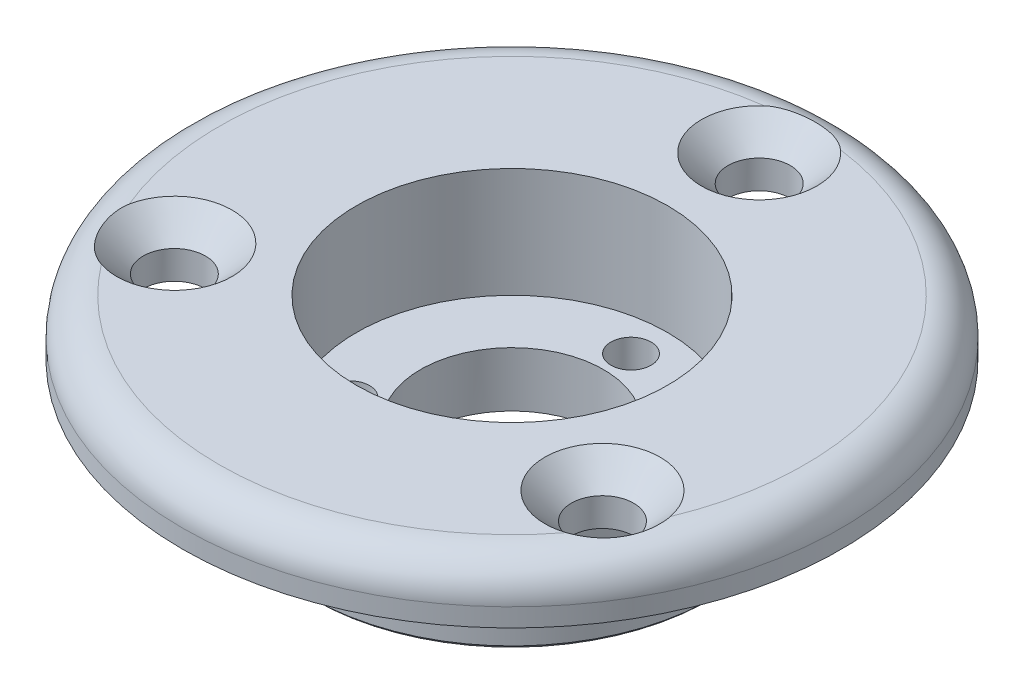
ISO-10303-21;
HEADER;
FILE_DESCRIPTION(('STEP AP214'),'2;1');
FILE_NAME('part.step','',(''),(''),'','','');
FILE_SCHEMA(('AUTOMOTIVE_DESIGN { 1 0 10303 214 1 1 1 1 }'));
ENDSEC;
DATA;
#1=APPLICATION_CONTEXT('core data for automotive mechanical design processes');
#2=APPLICATION_PROTOCOL_DEFINITION('international standard','automotive_design',2000,#1);
#3=PRODUCT_CONTEXT('',#1,'mechanical');
#4=PRODUCT('Part','Part','',(#3));
#5=PRODUCT_RELATED_PRODUCT_CATEGORY('part','',(#4));
#6=PRODUCT_DEFINITION_FORMATION('','',#4);
#7=PRODUCT_DEFINITION_CONTEXT('part definition',#1,'design');
#8=PRODUCT_DEFINITION('design','',#6,#7);
#9=PRODUCT_DEFINITION_SHAPE('','',#8);
#10=(LENGTH_UNIT() NAMED_UNIT(*) SI_UNIT(.MILLI.,.METRE.));
#11=(NAMED_UNIT(*) PLANE_ANGLE_UNIT() SI_UNIT($,.RADIAN.));
#12=(NAMED_UNIT(*) SI_UNIT($,.STERADIAN.) SOLID_ANGLE_UNIT());
#13=UNCERTAINTY_MEASURE_WITH_UNIT(LENGTH_MEASURE(1.E-05),#10,'distance_accuracy_value','');
#14=(GEOMETRIC_REPRESENTATION_CONTEXT(3) GLOBAL_UNCERTAINTY_ASSIGNED_CONTEXT((#13)) GLOBAL_UNIT_ASSIGNED_CONTEXT((#10,
#11,#12)) REPRESENTATION_CONTEXT('',''));
#15=CARTESIAN_POINT('',(0.,0.,0.));
#16=DIRECTION('',(0.,0.,1.));
#17=DIRECTION('',(1.,0.,0.));
#18=AXIS2_PLACEMENT_3D('',#15,#16,#17);
#19=CARTESIAN_POINT('',(0.,-3.,5.));
#20=DIRECTION('',(0.,-1.,0.));
#21=DIRECTION('',(0.,0.,-1.));
#22=AXIS2_PLACEMENT_3D('',#19,#20,#21);
#23=PLANE('',#22);
#24=CARTESIAN_POINT('',(0.,-3.,-6.5));
#25=DIRECTION('',(0.,-1.,0.));
#26=DIRECTION('',(0.,0.,-1.));
#27=AXIS2_PLACEMENT_3D('',#24,#25,#26);
#28=CIRCLE('',#27,2.2);
#29=CARTESIAN_POINT('',(-1.39735993677342,-3.,-4.80076923076923));
#30=VERTEX_POINT('',#29);
#31=CARTESIAN_POINT('',(1.39735993677341,-3.,-4.80076923076923));
#32=VERTEX_POINT('',#31);
#33=EDGE_CURVE('E50',#30,#32,#28,.T.);
#34=ORIENTED_EDGE('',*,*,#33,.F.);
#35=CARTESIAN_POINT('',(0.,-3.,0.));
#36=DIRECTION('',(0.,1.,0.));
#37=DIRECTION('',(0.,0.,1.));
#38=AXIS2_PLACEMENT_3D('',#35,#36,#37);
#39=CIRCLE('',#38,5.);
#40=CARTESIAN_POINT('',(-4.85626807993953,-3.,1.19023541190825));
#41=VERTEX_POINT('',#40);
#42=EDGE_CURVE('E95',#30,#41,#39,.T.);
#43=ORIENTED_EDGE('',*,*,#42,.T.);
#44=CARTESIAN_POINT('',(-5.62916512459884,-3.,3.25000000000003));
#45=DIRECTION('',(0.,-1.,0.));
#46=DIRECTION('',(0.,0.,-1.));
#47=AXIS2_PLACEMENT_3D('',#44,#45,#46);
#48=CIRCLE('',#47,2.2);
#49=CARTESIAN_POINT('',(-3.45890814316611,-3.,3.61053381886103));
#50=VERTEX_POINT('',#49);
#51=EDGE_CURVE('E222',#50,#41,#48,.T.);
#52=ORIENTED_EDGE('',*,*,#51,.F.);
#53=CARTESIAN_POINT('',(3.45890814316611,-3.,3.61053381886102));
#54=VERTEX_POINT('',#53);
#55=EDGE_CURVE('E107',#50,#54,#39,.T.);
#56=ORIENTED_EDGE('',*,*,#55,.T.);
#57=CARTESIAN_POINT('',(5.62916512459884,-3.,3.25000000000003));
#58=DIRECTION('',(0.,-1.,0.));
#59=DIRECTION('',(0.,0.,-1.));
#60=AXIS2_PLACEMENT_3D('',#57,#58,#59);
#61=CIRCLE('',#60,2.2);
#62=CARTESIAN_POINT('',(4.85626807993953,-3.,1.19023541190824));
#63=VERTEX_POINT('',#62);
#64=EDGE_CURVE('E57',#63,#54,#61,.T.);
#65=ORIENTED_EDGE('',*,*,#64,.F.);
#66=EDGE_CURVE('E97',#63,#32,#39,.T.);
#67=ORIENTED_EDGE('',*,*,#66,.T.);
#68=EDGE_LOOP('',(#34,#43,#52,#56,#65,#67));
#69=FACE_BOUND('',#68,.T.);
#70=CARTESIAN_POINT('',(0.,-3.,0.));
#71=DIRECTION('',(0.,-1.,0.));
#72=DIRECTION('',(0.,0.,-1.));
#73=AXIS2_PLACEMENT_3D('',#70,#71,#72);
#74=CIRCLE('',#73,10.8);
#75=CARTESIAN_POINT('',(0.,-3.,-10.8));
#76=VERTEX_POINT('',#75);
#77=EDGE_CURVE('E133',#76,#76,#74,.T.);
#78=ORIENTED_EDGE('',*,*,#77,.T.);
#79=EDGE_LOOP('',(#78));
#80=FACE_BOUND('',#79,.T.);
#81=ADVANCED_FACE('F35',(#69,#80),#23,.T.);
#82=CARTESIAN_POINT('',(0.,0.,0.));
#83=DIRECTION('',(0.,1.,0.));
#84=DIRECTION('',(0.,0.,1.));
#85=AXIS2_PLACEMENT_3D('',#82,#83,#84);
#86=CYLINDRICAL_SURFACE('',#85,11.);
#87=CARTESIAN_POINT('',(0.,-2.80000000000001,0.));
#88=DIRECTION('',(0.,-1.,0.));
#89=DIRECTION('',(0.,0.,-1.));
#90=AXIS2_PLACEMENT_3D('',#87,#88,#89);
#91=CIRCLE('',#90,11.);
#92=CARTESIAN_POINT('',(0.,-2.80000000000001,-11.));
#93=VERTEX_POINT('',#92);
#94=EDGE_CURVE('E130',#93,#93,#91,.F.);
#95=ORIENTED_EDGE('',*,*,#94,.T.);
#96=EDGE_LOOP('',(#95));
#97=FACE_BOUND('',#96,.T.);
#98=CARTESIAN_POINT('',(0.,3.,0.));
#99=DIRECTION('',(0.,1.,0.));
#100=DIRECTION('',(0.,0.,1.));
#101=AXIS2_PLACEMENT_3D('',#98,#99,#100);
#102=CIRCLE('',#101,11.);
#103=CARTESIAN_POINT('',(0.,3.,11.));
#104=VERTEX_POINT('',#103);
#105=EDGE_CURVE('E127',#104,#104,#102,.T.);
#106=ORIENTED_EDGE('',*,*,#105,.F.);
#107=EDGE_LOOP('',(#106));
#108=FACE_BOUND('',#107,.T.);
#109=ADVANCED_FACE('F234',(#97,#108),#86,.T.);
#110=CARTESIAN_POINT('',(0.,3.,11.));
#111=DIRECTION('',(0.,-1.,0.));
#112=DIRECTION('',(0.,0.,-1.));
#113=AXIS2_PLACEMENT_3D('',#110,#111,#112);
#114=PLANE('',#113);
#115=CARTESIAN_POINT('',(0.,3.,-13.5));
#116=DIRECTION('',(0.,-1.,0.));
#117=DIRECTION('',(0.,0.,-1.));
#118=AXIS2_PLACEMENT_3D('',#115,#116,#117);
#119=CIRCLE('',#118,1.7);
#120=CARTESIAN_POINT('',(0.,3.,-15.2));
#121=VERTEX_POINT('',#120);
#122=EDGE_CURVE('E142',#121,#121,#119,.T.);
#123=ORIENTED_EDGE('',*,*,#122,.F.);
#124=EDGE_LOOP('',(#123));
#125=FACE_BOUND('',#124,.T.);
#126=CARTESIAN_POINT('',(11.6913429510899,3.,6.75000000000006));
#127=DIRECTION('',(0.,-1.,0.));
#128=DIRECTION('',(0.,0.,-1.));
#129=AXIS2_PLACEMENT_3D('',#126,#127,#128);
#130=CIRCLE('',#129,1.7);
#131=CARTESIAN_POINT('',(11.6913429510899,3.,5.05000000000006));
#132=VERTEX_POINT('',#131);
#133=EDGE_CURVE('E137',#132,#132,#130,.T.);
#134=ORIENTED_EDGE('',*,*,#133,.F.);
#135=EDGE_LOOP('',(#134));
#136=FACE_BOUND('',#135,.T.);
#137=CARTESIAN_POINT('',(-11.6913429510899,3.,6.75000000000006));
#138=DIRECTION('',(0.,-1.,0.));
#139=DIRECTION('',(0.,0.,-1.));
#140=AXIS2_PLACEMENT_3D('',#137,#138,#139);
#141=CIRCLE('',#140,1.7);
#142=CARTESIAN_POINT('',(-11.6913429510899,3.,5.05000000000006));
#143=VERTEX_POINT('',#142);
#144=EDGE_CURVE('E105',#143,#143,#141,.T.);
#145=ORIENTED_EDGE('',*,*,#144,.F.);
#146=EDGE_LOOP('',(#145));
#147=FACE_BOUND('',#146,.T.);
#148=ORIENTED_EDGE('',*,*,#105,.T.);
#149=EDGE_LOOP('',(#148));
#150=FACE_BOUND('',#149,.T.);
#151=CARTESIAN_POINT('',(0.,3.,0.));
#152=DIRECTION('',(0.,1.,0.));
#153=DIRECTION('',(0.,0.,1.));
#154=AXIS2_PLACEMENT_3D('',#151,#152,#153);
#155=CIRCLE('',#154,18.);
#156=CARTESIAN_POINT('',(0.,3.,18.));
#157=VERTEX_POINT('',#156);
#158=EDGE_CURVE('E124',#157,#157,#155,.T.);
#159=ORIENTED_EDGE('',*,*,#158,.F.);
#160=EDGE_LOOP('',(#159));
#161=FACE_BOUND('',#160,.T.);
#162=ADVANCED_FACE('F239',(#125,#136,#147,#150,#161),#114,.T.);
#163=CARTESIAN_POINT('',(0.,0.,0.));
#164=DIRECTION('',(0.,1.,0.));
#165=DIRECTION('',(0.,0.,1.));
#166=AXIS2_PLACEMENT_3D('',#163,#164,#165);
#167=CYLINDRICAL_SURFACE('',#166,18.);
#168=CARTESIAN_POINT('',(0.,4.,0.));
#169=DIRECTION('',(0.,1.,0.));
#170=DIRECTION('',(0.,0.,1.));
#171=AXIS2_PLACEMENT_3D('',#168,#169,#170);
#172=CIRCLE('',#171,18.);
#173=CARTESIAN_POINT('',(0.,4.,18.));
#174=VERTEX_POINT('',#173);
#175=EDGE_CURVE('E188',#174,#174,#172,.F.);
#176=ORIENTED_EDGE('',*,*,#175,.T.);
#177=EDGE_LOOP('',(#176));
#178=FACE_BOUND('',#177,.T.);
#179=ORIENTED_EDGE('',*,*,#158,.T.);
#180=EDGE_LOOP('',(#179));
#181=FACE_BOUND('',#180,.T.);
#182=ADVANCED_FACE('F262',(#178,#181),#167,.T.);
#183=CARTESIAN_POINT('',(0.,6.,8.5));
#184=DIRECTION('',(0.,1.,0.));
#185=DIRECTION('',(0.,0.,1.));
#186=AXIS2_PLACEMENT_3D('',#183,#184,#185);
#187=PLANE('',#186);
#188=CARTESIAN_POINT('',(11.6913429510899,6.,6.75000000000006));
#189=DIRECTION('',(0.,1.,0.));
#190=DIRECTION('',(0.,0.,1.));
#191=AXIS2_PLACEMENT_3D('',#188,#189,#190);
#192=CIRCLE('',#191,3.15);
#193=CARTESIAN_POINT('',(14.7795350233813,6.,6.12905739022298));
#194=VERTEX_POINT('',#193);
#195=CARTESIAN_POINT('',(12.6976869128764,6.,9.73492409125864));
#196=VERTEX_POINT('',#195);
#197=EDGE_CURVE('E145',#194,#196,#192,.T.);
#198=ORIENTED_EDGE('',*,*,#197,.F.);
#199=CARTESIAN_POINT('',(0.,6.,0.));
#200=DIRECTION('',(0.,1.,0.));
#201=DIRECTION('',(0.,0.,1.));
#202=AXIS2_PLACEMENT_3D('',#199,#200,#201);
#203=CIRCLE('',#202,16.);
#204=CARTESIAN_POINT('',(2.08184811050485,6.,-15.8639814814815));
#205=VERTEX_POINT('',#204);
#206=EDGE_CURVE('E150',#194,#205,#203,.T.);
#207=ORIENTED_EDGE('',*,*,#206,.T.);
#208=CARTESIAN_POINT('',(0.,6.,-13.5));
#209=DIRECTION('',(0.,1.,0.));
#210=DIRECTION('',(0.,0.,1.));
#211=AXIS2_PLACEMENT_3D('',#208,#209,#210);
#212=CIRCLE('',#211,3.15);
#213=CARTESIAN_POINT('',(-2.08184811050485,6.,-15.8639814814815));
#214=VERTEX_POINT('',#213);
#215=EDGE_CURVE('E295',#214,#205,#212,.T.);
#216=ORIENTED_EDGE('',*,*,#215,.F.);
#217=CARTESIAN_POINT('',(0.,6.,0.));
#218=DIRECTION('',(0.,1.,0.));
#219=DIRECTION('',(0.,0.,1.));
#220=AXIS2_PLACEMENT_3D('',#217,#218,#219);
#221=CIRCLE('',#220,16.);
#222=CARTESIAN_POINT('',(-14.7795350233813,6.,6.12905739022298));
#223=VERTEX_POINT('',#222);
#224=EDGE_CURVE('E148',#214,#223,#221,.T.);
#225=ORIENTED_EDGE('',*,*,#224,.T.);
#226=CARTESIAN_POINT('',(-11.6913429510899,6.,6.75000000000006));
#227=DIRECTION('',(0.,1.,0.));
#228=DIRECTION('',(0.,0.,1.));
#229=AXIS2_PLACEMENT_3D('',#226,#227,#228);
#230=CIRCLE('',#229,3.15);
#231=CARTESIAN_POINT('',(-12.6976869128764,6.,9.73492409125864));
#232=VERTEX_POINT('',#231);
#233=EDGE_CURVE('E140',#232,#223,#230,.T.);
#234=ORIENTED_EDGE('',*,*,#233,.F.);
#235=CARTESIAN_POINT('',(0.,6.,0.));
#236=DIRECTION('',(0.,1.,0.));
#237=DIRECTION('',(0.,0.,1.));
#238=AXIS2_PLACEMENT_3D('',#235,#236,#237);
#239=CIRCLE('',#238,16.);
#240=EDGE_CURVE('E135',#232,#196,#239,.T.);
#241=ORIENTED_EDGE('',*,*,#240,.T.);
#242=EDGE_LOOP('',(#198,#207,#216,#225,#234,#241));
#243=FACE_BOUND('',#242,.T.);
#244=CARTESIAN_POINT('',(0.,6.,0.));
#245=DIRECTION('',(0.,1.,0.));
#246=DIRECTION('',(0.,0.,1.));
#247=AXIS2_PLACEMENT_3D('',#244,#245,#246);
#248=CIRCLE('',#247,8.5);
#249=CARTESIAN_POINT('',(0.,6.,8.5));
#250=VERTEX_POINT('',#249);
#251=EDGE_CURVE('E119',#250,#250,#248,.T.);
#252=ORIENTED_EDGE('',*,*,#251,.F.);
#253=EDGE_LOOP('',(#252));
#254=FACE_BOUND('',#253,.T.);
#255=ADVANCED_FACE('F267',(#243,#254),#187,.T.);
#256=CARTESIAN_POINT('',(0.,0.,0.));
#257=DIRECTION('',(0.,1.,0.));
#258=DIRECTION('',(0.,0.,1.));
#259=AXIS2_PLACEMENT_3D('',#256,#257,#258);
#260=CYLINDRICAL_SURFACE('',#259,8.5);
#261=ORIENTED_EDGE('',*,*,#251,.T.);
#262=EDGE_LOOP('',(#261));
#263=FACE_BOUND('',#262,.T.);
#264=CARTESIAN_POINT('',(0.,0.,0.));
#265=DIRECTION('',(0.,1.,0.));
#266=DIRECTION('',(0.,0.,1.));
#267=AXIS2_PLACEMENT_3D('',#264,#265,#266);
#268=CIRCLE('',#267,8.5);
#269=CARTESIAN_POINT('',(0.,0.,8.5));
#270=VERTEX_POINT('',#269);
#271=EDGE_CURVE('E116',#270,#270,#268,.T.);
#272=ORIENTED_EDGE('',*,*,#271,.F.);
#273=EDGE_LOOP('',(#272));
#274=FACE_BOUND('',#273,.T.);
#275=ADVANCED_FACE('F273',(#263,#274),#260,.F.);
#276=CARTESIAN_POINT('',(0.,0.,5.));
#277=DIRECTION('',(0.,1.,0.));
#278=DIRECTION('',(0.,0.,1.));
#279=AXIS2_PLACEMENT_3D('',#276,#277,#278);
#280=PLANE('',#279);
#281=CARTESIAN_POINT('',(0.,0.,-6.5));
#282=DIRECTION('',(0.,1.,0.));
#283=DIRECTION('',(0.,0.,1.));
#284=AXIS2_PLACEMENT_3D('',#281,#282,#283);
#285=CIRCLE('',#284,1.09999999999999);
#286=CARTESIAN_POINT('',(0.,0.,-5.40000000000001));
#287=VERTEX_POINT('',#286);
#288=EDGE_CURVE('E40',#287,#287,#285,.T.);
#289=ORIENTED_EDGE('',*,*,#288,.F.);
#290=EDGE_LOOP('',(#289));
#291=FACE_BOUND('',#290,.T.);
#292=CARTESIAN_POINT('',(5.62916512459884,0.,3.25000000000003));
#293=DIRECTION('',(0.,1.,0.));
#294=DIRECTION('',(0.,0.,1.));
#295=AXIS2_PLACEMENT_3D('',#292,#293,#294);
#296=CIRCLE('',#295,1.09999999999999);
#297=CARTESIAN_POINT('',(5.62916512459884,0.,4.35000000000002));
#298=VERTEX_POINT('',#297);
#299=EDGE_CURVE('E220',#298,#298,#296,.T.);
#300=ORIENTED_EDGE('',*,*,#299,.F.);
#301=EDGE_LOOP('',(#300));
#302=FACE_BOUND('',#301,.T.);
#303=CARTESIAN_POINT('',(-5.62916512459884,0.,3.25000000000003));
#304=DIRECTION('',(0.,1.,0.));
#305=DIRECTION('',(0.,0.,1.));
#306=AXIS2_PLACEMENT_3D('',#303,#304,#305);
#307=CIRCLE('',#306,1.09999999999999);
#308=CARTESIAN_POINT('',(-5.62916512459884,0.,4.35000000000002));
#309=VERTEX_POINT('',#308);
#310=EDGE_CURVE('E196',#309,#309,#307,.T.);
#311=ORIENTED_EDGE('',*,*,#310,.F.);
#312=EDGE_LOOP('',(#311));
#313=FACE_BOUND('',#312,.T.);
#314=ORIENTED_EDGE('',*,*,#271,.T.);
#315=EDGE_LOOP('',(#314));
#316=FACE_BOUND('',#315,.T.);
#317=CARTESIAN_POINT('',(0.,0.,0.));
#318=DIRECTION('',(0.,1.,0.));
#319=DIRECTION('',(0.,0.,1.));
#320=AXIS2_PLACEMENT_3D('',#317,#318,#319);
#321=CIRCLE('',#320,5.);
#322=CARTESIAN_POINT('',(0.,0.,5.));
#323=VERTEX_POINT('',#322);
#324=EDGE_CURVE('E114',#323,#323,#321,.T.);
#325=ORIENTED_EDGE('',*,*,#324,.F.);
#326=EDGE_LOOP('',(#325));
#327=FACE_BOUND('',#326,.T.);
#328=ADVANCED_FACE('F253',(#291,#302,#313,#316,#327),#280,.T.);
#329=CARTESIAN_POINT('',(0.,0.,0.));
#330=DIRECTION('',(0.,1.,0.));
#331=DIRECTION('',(0.,0.,1.));
#332=AXIS2_PLACEMENT_3D('',#329,#330,#331);
#333=CYLINDRICAL_SURFACE('',#332,5.);
#334=CARTESIAN_POINT('',(1.39759249001839,-3.0002,-4.80070153538461));
#335=CARTESIAN_POINT('',(1.34290477132306,-2.95322698470851,-4.81661120550945));
#336=CARTESIAN_POINT('',(1.28738980897507,-2.9069106747556,-4.83177003410822));
#337=CARTESIAN_POINT('',(1.17410549312497,-2.8161603229236,-4.86054863272246));
#338=CARTESIAN_POINT('',(1.11632844791568,-2.77173401322828,-4.87416240152792));
#339=CARTESIAN_POINT('',(0.996471678843506,-2.68434533718589,-4.90009352708124));
#340=CARTESIAN_POINT('',(0.93431380394682,-2.64147282199566,-4.91235671301323));
#341=CARTESIAN_POINT('',(0.80690977489325,-2.56015925635464,-4.93488353270095));
#342=CARTESIAN_POINT('',(0.741668707107225,-2.52171124360547,-4.94515032599656));
#343=CARTESIAN_POINT('',(0.607469026010579,-2.45128310639206,-4.96342310169418));
#344=CARTESIAN_POINT('',(0.538513271867463,-2.41929809500635,-4.97143079411734));
#345=CARTESIAN_POINT('',(0.396983915871148,-2.36507005017128,-4.9847153349031));
#346=CARTESIAN_POINT('',(0.324440007192171,-2.34275839170678,-4.99001146992408));
#347=CARTESIAN_POINT('',(0.212718298924938,-2.31889714303432,-4.99561653550752));
#348=CARTESIAN_POINT('',(0.174613308938815,-2.31253129784518,-4.99709757043583));
#349=CARTESIAN_POINT('',(0.0979348917087521,-2.30352327999584,-4.99918761353278));
#350=CARTESIAN_POINT('',(0.0593615343795264,-2.30088055830074,-4.99979675027714));
#351=CARTESIAN_POINT('',(-0.0178341321682291,-2.29949306582036,-5.00011702334243));
#352=CARTESIAN_POINT('',(-0.05645639014404,-2.30074564107835,-4.99982877107528));
#353=CARTESIAN_POINT('',(-0.133366213988251,-2.3070519960109,-4.99836943561154));
#354=CARTESIAN_POINT('',(-0.17165373079917,-2.31210632370278,-4.99719822513769));
#355=CARTESIAN_POINT('',(-0.291313743584783,-2.33361228267078,-4.99217367412059));
#356=CARTESIAN_POINT('',(-0.371496585835684,-2.35648592274487,-4.98678484228079));
#357=CARTESIAN_POINT('',(-0.52773839494247,-2.41421454970962,-4.97270200565582));
#358=CARTESIAN_POINT('',(-0.603745928334117,-2.44919141538506,-4.96397428019951));
#359=CARTESIAN_POINT('',(-0.744503396838622,-2.5233290926934,-4.94472249088295));
#360=CARTESIAN_POINT('',(-0.809648714276447,-2.56182099870416,-4.93443369421833));
#361=CARTESIAN_POINT('',(-0.936871071497187,-2.64319504148982,-4.91186858881065));
#362=CARTESIAN_POINT('',(-0.998943363127662,-2.68608367590253,-4.89958932245346));
#363=CARTESIAN_POINT('',(-1.11828317397184,-2.77322340010962,-4.87370882192471));
#364=CARTESIAN_POINT('',(-1.17564332924179,-2.81736829348418,-4.86017186687038));
#365=CARTESIAN_POINT('',(-1.28813370377718,-2.90753028880107,-4.83156703666756));
#366=CARTESIAN_POINT('',(-1.34327122173924,-2.95354006141355,-4.81650486110348));
#367=CARTESIAN_POINT('',(-1.39759249001839,-3.0002,-4.80070153538461));
#368=B_SPLINE_CURVE_WITH_KNOTS('',3,(#334,#335,#336,#337,#338,#339,#340,#341,#342,#343,#344,
#345,#346,#347,#348,#349,#350,#351,#352,#353,#354,#355,#356,#357,#358,#359,#360,#361,#362,#363,
#364,#365,#366,#367),.UNSPECIFIED.,.F.,.F.,(4,2,2,2,2,2,2,2,2,2,2,2,2,2,2,2,4),(0.,
0.221517356790479,0.443867624240583,0.673203911135931,0.902174236794023,1.13097077599598,
1.35811650716166,1.47393428084682,1.58973497353568,1.70545678579975,1.82119528239935,
2.0702953798257,2.32198063642909,2.55079778511758,2.77995810056625,3.00078836443513,
3.22082189912864),.UNSPECIFIED.);
#369=EDGE_CURVE('E11',#32,#30,#368,.T.);
#370=ORIENTED_EDGE('',*,*,#369,.F.);
#371=ORIENTED_EDGE('',*,*,#66,.F.);
#372=CARTESIAN_POINT('',(3.45873324062083,-3.0002,3.61070136818659));
#373=CARTESIAN_POINT('',(3.49985527846243,-2.95322698470851,3.57129524958384));
#374=CARTESIAN_POINT('',(3.54074069029457,-2.9069106747556,3.53079729619973));
#375=CARTESIAN_POINT('',(3.62230584570487,-2.8161603229236,3.44707950013032));
#376=CARTESIAN_POINT('',(3.66298423793629,-2.77173401322828,3.40384999562621));
#377=CARTESIAN_POINT('',(3.74536963595028,-2.68434533718589,3.31301655157084));
#378=CARTESIAN_POINT('',(3.78706880394705,-2.64147282199566,3.26531784583105));
#379=CARTESIAN_POINT('',(3.87027961658988,-2.56015925635464,3.16624612997003));
#380=CARTESIAN_POINT('',(3.91179145429229,-2.52171124360548,3.11487910454512));
#381=CARTESIAN_POINT('',(3.99471598279241,-2.45128310639206,3.00779515938446));
#382=CARTESIAN_POINT('',(4.03612872492812,-2.41929809500635,2.95208157077099));
#383=CARTESIAN_POINT('',(4.11839815272435,-2.36507005017128,2.83615582348981));
#384=CARTESIAN_POINT('',(4.15925669453388,-2.34275839170678,2.77597902319448));
#385=CARTESIAN_POINT('',(4.21997167785263,-2.31889714303432,2.68202771847259));
#386=CARTESIAN_POINT('',(4.24030678671751,-2.31253129784518,2.64976834659781));
#387=CARTESIAN_POINT('',(4.2804560257495,-2.30352327999584,2.58440791090307));
#388=CARTESIAN_POINT('',(4.30027023230911,-2.30088055830074,2.55130697191888));
#389=CARTESIAN_POINT('',(4.33914543019368,-2.29949306582036,2.4846137001591));
#390=CARTESIAN_POINT('',(4.35820692539553,-2.30074564107835,2.45102171746696));
#391=CARTESIAN_POINT('',(4.39539801573339,-2.30705199601091,2.38368618848541));
#392=CARTESIAN_POINT('',(4.41352747611532,-2.31210632370278,2.34994262104241));
#393=CARTESIAN_POINT('',(4.46900609368471,-2.33361228267078,2.24380173464435));
#394=CARTESIAN_POINT('',(4.50443064954017,-2.35648592274487,2.17166694038753));
#395=CARTESIAN_POINT('',(4.570355459819,-2.41421454970962,2.02931614625533));
#396=CARTESIAN_POINT('',(4.6008007945524,-2.44919141538506,1.95912782873101));
#397=CARTESIAN_POINT('',(4.6545069901882,-2.5233290926934,1.82760239057544));
#398=CARTESIAN_POINT('',(4.67816928962119,-2.56182099870417,1.76604049240437));
#399=CARTESIAN_POINT('',(4.72223851370944,-2.64319504148984,1.64458014641801));
#400=CARTESIAN_POINT('',(4.74264050291951,-2.68608367590256,1.5846843318163));
#401=CARTESIAN_POINT('',(4.77989723742105,-2.77322340010965,1.46839277367803));
#402=CARTESIAN_POINT('',(4.79685396808909,-2.81736829348422,1.41194894452206));
#403=CARTESIAN_POINT('',(4.82832664573021,-2.90753028880111,1.30022700739176));
#404=CARTESIAN_POINT('',(4.84285117803648,-2.9535400614136,1.24494542835295));
#405=CARTESIAN_POINT('',(4.85632573063924,-3.00020000000006,1.19000016719799));
#406=B_SPLINE_CURVE_WITH_KNOTS('',3,(#372,#373,#374,#375,#376,#377,#378,#379,#380,#381,#382,
#383,#384,#385,#386,#387,#388,#389,#390,#391,#392,#393,#394,#395,#396,#397,#398,#399,#400,#401,
#402,#403,#404,#405),.UNSPECIFIED.,.F.,.F.,(4,2,2,2,2,2,2,2,2,2,2,2,2,2,2,2,4),(0.,
0.221517356790478,0.443867624240581,0.67320391113593,0.90217423679402,1.13097077599597,
1.35811650716166,1.47393428084681,1.58973497353568,1.70545678579974,1.82119528239935,
2.0702953798257,2.32198063642908,2.5507977851176,2.77995810056629,3.0007883644352,
3.22082189912873),.UNSPECIFIED.);
#407=EDGE_CURVE('E45',#54,#63,#406,.T.);
#408=ORIENTED_EDGE('',*,*,#407,.F.);
#409=ORIENTED_EDGE('',*,*,#55,.F.);
#410=CARTESIAN_POINT('',(-4.85632573063924,-3.00020000000006,1.19000016719799));
#411=CARTESIAN_POINT('',(-4.84276004978551,-2.95322698470856,1.24531595592559));
#412=CARTESIAN_POINT('',(-4.82813049926966,-2.90691067475565,1.30097273790847));
#413=CARTESIAN_POINT('',(-4.79641133882986,-2.81616032292364,1.41346913259213));
#414=CARTESIAN_POINT('',(-4.77931268585199,-2.77173401322832,1.4703124059017));
#415=CARTESIAN_POINT('',(-4.74184131479381,-2.68434533718592,1.5870769755104));
#416=CARTESIAN_POINT('',(-4.72138260789389,-2.64147282199568,1.64703886718219));
#417=CARTESIAN_POINT('',(-4.67718939148314,-2.56015925635466,1.76863740273094));
#418=CARTESIAN_POINT('',(-4.65346016139953,-2.52171124360549,1.83027122145147));
#419=CARTESIAN_POINT('',(-4.602185008803,-2.45128310639207,1.95562794230975));
#420=CARTESIAN_POINT('',(-4.57464199679559,-2.41929809500636,2.01934922334638));
#421=CARTESIAN_POINT('',(-4.51538206859551,-2.36507005017129,2.14855951141332));
#422=CARTESIAN_POINT('',(-4.48369670172606,-2.34275839170678,2.21403244672962));
#423=CARTESIAN_POINT('',(-4.43268997677758,-2.31889714303432,2.31358881703496));
#424=CARTESIAN_POINT('',(-4.41492009565633,-2.31253129784518,2.34732922383805));
#425=CARTESIAN_POINT('',(-4.37839091745826,-2.30352327999585,2.41477970262974));
#426=CARTESIAN_POINT('',(-4.35963176668865,-2.30088055830074,2.44848977835829));
#427=CARTESIAN_POINT('',(-4.32131129802545,-2.29949306582036,2.51550332318336));
#428=CARTESIAN_POINT('',(-4.3017505352515,-2.30074564107835,2.54880705360835));
#429=CARTESIAN_POINT('',(-4.26203180174515,-2.30705199601091,2.61468324712615));
#430=CARTESIAN_POINT('',(-4.24187374531616,-2.31210632370278,2.64725560409531));
#431=CARTESIAN_POINT('',(-4.17769235009993,-2.33361228267078,2.74837193947627));
#432=CARTESIAN_POINT('',(-4.13293406370449,-2.35648592274487,2.81511790189329));
#433=CARTESIAN_POINT('',(-4.04261706487653,-2.41421454970962,2.94338585940052));
#434=CARTESIAN_POINT('',(-3.99705486621829,-2.44919141538505,3.00484645146853));
#435=CARTESIAN_POINT('',(-3.91000359334958,-2.52332909269339,3.11712010030753));
#436=CARTESIAN_POINT('',(-3.86852057534474,-2.56182099870415,3.16839320181399));
#437=CARTESIAN_POINT('',(-3.78536744221224,-2.64319504148981,3.26728844239265));
#438=CARTESIAN_POINT('',(-3.74369713979184,-2.68608367590253,3.31490499063716));
#439=CARTESIAN_POINT('',(-3.6616140634492,-2.77322340010961,3.40531604824667));
#440=CARTESIAN_POINT('',(-3.62121063884728,-2.81736829348418,3.44822292234831));
#441=CARTESIAN_POINT('',(-3.540192941953,-2.90753028880106,3.53134002927577));
#442=CARTESIAN_POINT('',(-3.49957995629721,-2.95354006141355,3.5715594327505));
#443=CARTESIAN_POINT('',(-3.45873324062083,-3.0002,3.61070136818659));
#444=B_SPLINE_CURVE_WITH_KNOTS('',3,(#410,#411,#412,#413,#414,#415,#416,#417,#418,#419,#420,
#421,#422,#423,#424,#425,#426,#427,#428,#429,#430,#431,#432,#433,#434,#435,#436,#437,#438,#439,
#440,#441,#442,#443),.UNSPECIFIED.,.F.,.F.,(4,2,2,2,2,2,2,2,2,2,2,2,2,2,2,2,4),(0.,
0.221517356790498,0.44386762424062,0.673203911135989,0.902174236794099,1.13097077599605,
1.35811650716174,1.47393428084689,1.58973497353576,1.70545678579982,1.82119528239943,
2.07029537982578,2.32198063642916,2.55079778511766,2.77995810056633,3.00078836443521,
3.22082189912873),.UNSPECIFIED.);
#445=EDGE_CURVE('E104',#41,#50,#444,.T.);
#446=ORIENTED_EDGE('',*,*,#445,.F.);
#447=ORIENTED_EDGE('',*,*,#42,.F.);
#448=EDGE_LOOP('',(#370,#371,#408,#409,#446,#447));
#449=FACE_BOUND('',#448,.T.);
#450=ORIENTED_EDGE('',*,*,#324,.T.);
#451=EDGE_LOOP('',(#450));
#452=FACE_BOUND('',#451,.T.);
#453=ADVANCED_FACE('F101',(#449,#452),#333,.F.);
#454=CARTESIAN_POINT('',(0.,-2.80000000000001,0.));
#455=DIRECTION('',(0.,1.,0.));
#456=DIRECTION('',(0.,0.,1.));
#457=AXIS2_PLACEMENT_3D('',#454,#455,#456);
#458=CONICAL_SURFACE('',#457,11.,0.785398163397454);
#459=ORIENTED_EDGE('',*,*,#77,.F.);
#460=EDGE_LOOP('',(#459));
#461=FACE_BOUND('',#460,.T.);
#462=ORIENTED_EDGE('',*,*,#94,.F.);
#463=EDGE_LOOP('',(#462));
#464=FACE_BOUND('',#463,.T.);
#465=ADVANCED_FACE('F243',(#461,#464),#458,.T.);
#466=CARTESIAN_POINT('',(-11.6913429510899,6.,6.75000000000006));
#467=DIRECTION('',(0.,1.,0.));
#468=DIRECTION('',(0.,0.,1.));
#469=AXIS2_PLACEMENT_3D('',#466,#467,#468);
#470=CYLINDRICAL_SURFACE('',#469,1.7);
#471=ORIENTED_EDGE('',*,*,#144,.T.);
#472=EDGE_LOOP('',(#471));
#473=FACE_BOUND('',#472,.T.);
#474=CARTESIAN_POINT('',(-11.6913429510899,4.55,6.75000000000006));
#475=DIRECTION('',(0.,1.,0.));
#476=DIRECTION('',(0.,0.,1.));
#477=AXIS2_PLACEMENT_3D('',#474,#475,#476);
#478=CIRCLE('',#477,1.7);
#479=CARTESIAN_POINT('',(-11.6913429510899,4.55,8.45000000000006));
#480=VERTEX_POINT('',#479);
#481=EDGE_CURVE('E109',#480,#480,#478,.T.);
#482=ORIENTED_EDGE('',*,*,#481,.T.);
#483=EDGE_LOOP('',(#482));
#484=FACE_BOUND('',#483,.T.);
#485=ADVANCED_FACE('F245',(#473,#484),#470,.F.);
#486=CARTESIAN_POINT('',(-11.6913429510899,6.,6.75000000000006));
#487=DIRECTION('',(0.,1.,0.));
#488=DIRECTION('',(0.,0.,1.));
#489=AXIS2_PLACEMENT_3D('',#486,#487,#488);
#490=CONICAL_SURFACE('',#489,3.15,0.785398163397449);
#491=ORIENTED_EDGE('',*,*,#481,.F.);
#492=EDGE_LOOP('',(#491));
#493=FACE_BOUND('',#492,.T.);
#494=ORIENTED_EDGE('',*,*,#233,.T.);
#495=CARTESIAN_POINT('',(-14.7795350233813,6.,6.12905739022298));
#496=CARTESIAN_POINT('',(-14.7873395810359,5.99999668059333,6.16788784129385));
#497=CARTESIAN_POINT('',(-14.7940563452865,5.99963455352129,6.2069211992617));
#498=CARTESIAN_POINT('',(-14.8054327604498,5.99832889877805,6.28525859087468));
#499=CARTESIAN_POINT('',(-14.8100934332992,5.99738566049582,6.32456248016971));
#500=CARTESIAN_POINT('',(-14.8211601006317,5.99389365016638,6.44253664011186));
#501=CARTESIAN_POINT('',(-14.8246889220853,5.99068118655588,6.52146676621617));
#502=CARTESIAN_POINT('',(-14.8248445851107,5.98333199749789,6.67876213007903));
#503=CARTESIAN_POINT('',(-14.8215139750575,5.9792011107442,6.75712784258382));
#504=CARTESIAN_POINT('',(-14.8086467728351,5.97060004879904,6.9133790189026));
#505=CARTESIAN_POINT('',(-14.7991052830598,5.96612960831101,6.99126405470833));
#506=CARTESIAN_POINT('',(-14.7713911082979,5.95628146144715,7.16427936084401));
#507=CARTESIAN_POINT('',(-14.7517193667131,5.95093675469201,7.25917197216569));
#508=CARTESIAN_POINT('',(-14.7043749402551,5.94108384721435,7.44699115301427));
#509=CARTESIAN_POINT('',(-14.6767001670119,5.93657586533776,7.53991720257081));
#510=CARTESIAN_POINT('',(-14.613820573297,5.92883319408838,7.72353295732575));
#511=CARTESIAN_POINT('',(-14.5785944243677,5.92560218653479,7.81421549938756));
#512=CARTESIAN_POINT('',(-14.5011125559197,5.92072023998471,7.99256368517572));
#513=CARTESIAN_POINT('',(-14.4588569417074,5.91906927732053,8.08022937407292));
#514=CARTESIAN_POINT('',(-14.3671677247055,5.91747679938921,8.25301294751837));
#515=CARTESIAN_POINT('',(-14.3176583319631,5.91755483254687,8.33809079375306));
#516=CARTESIAN_POINT('',(-14.2121406777333,5.91946215511411,8.50409474347843));
#517=CARTESIAN_POINT('',(-14.1561325515106,5.92129140807949,8.58502093333124));
#518=CARTESIAN_POINT('',(-14.0378826684901,5.92654294077049,8.74211603524839));
#519=CARTESIAN_POINT('',(-13.9756416433869,5.92996503368053,8.81828550401489));
#520=CARTESIAN_POINT('',(-13.8451406324563,5.93808812474777,8.96519209542289));
#521=CARTESIAN_POINT('',(-13.7768822301461,5.94278878711502,9.03593063813939));
#522=CARTESIAN_POINT('',(-13.649870579238,5.95187733294112,9.15660137394334));
#523=CARTESIAN_POINT('',(-13.5922409905369,5.95611414111113,9.2077312065133));
#524=CARTESIAN_POINT('',(-13.473459684475,5.96474338615548,9.30569781549671));
#525=CARTESIAN_POINT('',(-13.4123087914936,5.96913578651189,9.35253559013197));
#526=CARTESIAN_POINT('',(-13.286781092404,5.9776391362702,9.4412023741888));
#527=CARTESIAN_POINT('',(-13.2224167234364,5.98175104410484,9.48304884806976));
#528=CARTESIAN_POINT('',(-13.0903954933055,5.98916335719407,9.56120287938179));
#529=CARTESIAN_POINT('',(-13.0227411752819,5.99246437768696,9.59751462814382));
#530=CARTESIAN_POINT('',(-12.9119903603987,5.99652204116984,9.65047219812097));
#531=CARTESIAN_POINT('',(-12.8698915342624,5.99776828452288,9.66917574543265));
#532=CARTESIAN_POINT('',(-12.7845916970507,5.99950438506196,9.70403291551244));
#533=CARTESIAN_POINT('',(-12.7413896694405,5.99999351702225,9.72018408011381));
#534=CARTESIAN_POINT('',(-12.6976869128764,6.,9.73492409125864));
#535=B_SPLINE_CURVE_WITH_KNOTS('',3,(#495,#496,#497,#498,#499,#500,#501,#502,#503,#504,#505,
#506,#507,#508,#509,#510,#511,#512,#513,#514,#515,#516,#517,#518,#519,#520,#521,#522,#523,#524,
#525,#526,#527,#528,#529,#530,#531,#532,#533,#534),.UNSPECIFIED.,.F.,.F.,(4,2,2,2,2,2,2,2,2,2,2,
2,2,2,2,2,2,2,2,4),(0.,0.118778821024917,0.237498538859365,0.474337838804339,0.709712473409139,
0.945272938533499,1.23605704537756,1.52691710014693,1.81860976005522,2.11029805059529,
2.40528590178608,2.7002676141933,2.99521473850768,3.29008447570162,3.52137894885116,
3.7526194916236,3.98302559212811,4.21325633466549,4.35142509436457,4.48972612214063),.UNSPECIFIED.);
#536=EDGE_CURVE('E159',#223,#232,#535,.T.);
#537=ORIENTED_EDGE('',*,*,#536,.T.);
#538=EDGE_LOOP('',(#494,#537));
#539=FACE_BOUND('',#538,.T.);
#540=ADVANCED_FACE('F251',(#493,#539),#490,.F.);
#541=CARTESIAN_POINT('',(11.6913429510899,6.,6.75000000000006));
#542=DIRECTION('',(0.,1.,0.));
#543=DIRECTION('',(0.,0.,1.));
#544=AXIS2_PLACEMENT_3D('',#541,#542,#543);
#545=CYLINDRICAL_SURFACE('',#544,1.7);
#546=ORIENTED_EDGE('',*,*,#133,.T.);
#547=EDGE_LOOP('',(#546));
#548=FACE_BOUND('',#547,.T.);
#549=CARTESIAN_POINT('',(11.6913429510899,4.55,6.75000000000006));
#550=DIRECTION('',(0.,1.,0.));
#551=DIRECTION('',(0.,0.,1.));
#552=AXIS2_PLACEMENT_3D('',#549,#550,#551);
#553=CIRCLE('',#552,1.7);
#554=CARTESIAN_POINT('',(11.6913429510899,4.55,8.45000000000005));
#555=VERTEX_POINT('',#554);
#556=EDGE_CURVE('E141',#555,#555,#553,.T.);
#557=ORIENTED_EDGE('',*,*,#556,.T.);
#558=EDGE_LOOP('',(#557));
#559=FACE_BOUND('',#558,.T.);
#560=ADVANCED_FACE('F181',(#548,#559),#545,.F.);
#561=CARTESIAN_POINT('',(11.6913429510899,6.,6.75000000000006));
#562=DIRECTION('',(0.,1.,0.));
#563=DIRECTION('',(0.,0.,1.));
#564=AXIS2_PLACEMENT_3D('',#561,#562,#563);
#565=CONICAL_SURFACE('',#564,3.15,0.785398163397449);
#566=ORIENTED_EDGE('',*,*,#556,.F.);
#567=EDGE_LOOP('',(#566));
#568=FACE_BOUND('',#567,.T.);
#569=ORIENTED_EDGE('',*,*,#197,.T.);
#570=CARTESIAN_POINT('',(12.6976869128764,6.,9.73492409125864));
#571=CARTESIAN_POINT('',(12.7352173487715,5.99999668059334,9.72226781091741));
#572=CARTESIAN_POINT('',(12.7723796104919,5.99963455352129,9.70856802040572));
#573=CARTESIAN_POINT('',(12.8459099892767,5.99832889877805,9.67925158913471));
#574=CARTESIAN_POINT('',(12.8822784922984,5.99738566049582,9.66363590557351));
#575=CARTESIAN_POINT('',(12.9899804454647,5.99389365016638,9.61423284064761));
#576=CARTESIAN_POINT('',(13.0601003505217,5.99068118655588,9.57782382661964));
#577=CARTESIAN_POINT('',(13.1963999630372,5.98333199749789,9.49931095282267));
#578=CARTESIAN_POINT('',(13.2626013558254,5.9792011107442,9.45724370365411));
#579=CARTESIAN_POINT('',(13.3914852427775,5.97060004879904,9.36797479149448));
#580=CARTESIAN_POINT('',(13.4541649174722,5.966129608311,9.32076910105627));
#581=CARTESIAN_POINT('',(13.5901434804483,5.95628146144715,9.21026026859971));
#582=CARTESIAN_POINT('',(13.6624870216919,5.95093675469201,9.14577773498971));
#583=CARTESIAN_POINT('',(13.8014709903958,5.94108384721435,9.01086666852519));
#584=CARTESIAN_POINT('',(13.8681099233635,5.93657586533776,8.94043658707431));
#585=CARTESIAN_POINT('',(13.9956860346589,5.92883319408837,8.79417338416017));
#586=CARTESIAN_POINT('',(14.0566063452995,5.92560218653478,8.71832537327895));
#587=CARTESIAN_POINT('',(14.1723194706869,5.92072023998471,8.56205001397624));
#588=CARTESIAN_POINT('',(14.227112377206,5.91906927732053,8.4816227341673));
#589=CARTESIAN_POINT('',(14.3309027326655,5.91747679938921,8.3158257562678));
#590=CARTESIAN_POINT('',(14.3798276124328,5.91755483254687,8.2304104413096));
#591=CARTESIAN_POINT('',(14.4708324229086,5.91946215511411,8.05602749733612));
#592=CARTESIAN_POINT('',(14.5129124960413,5.92129140807949,7.96705994228255));
#593=CARTESIAN_POINT('',(14.5898359036014,5.92654294077049,7.78610498863366));
#594=CARTESIAN_POINT('',(14.6246800859943,5.92996503368053,7.69411794535343));
#595=CARTESIAN_POINT('',(14.6866544206717,5.93808812474777,7.507647458964));
#596=CARTESIAN_POINT('',(14.7137865945358,5.94278878711502,7.41316467718335));
#597=CARTESIAN_POINT('',(14.7547846917813,5.95187733294112,7.24283399301838));
#598=CARTESIAN_POINT('',(14.7702496313277,5.95611414111113,7.16736038890862));
#599=CARTESIAN_POINT('',(14.795700550399,5.96474338615548,7.01550945587262));
#600=CARTESIAN_POINT('',(14.8056878065991,5.96913578651189,6.93913234176901));
#601=CARTESIAN_POINT('',(14.8197116445194,5.9776391362702,6.78608877345034));
#602=CARTESIAN_POINT('',(14.8237695694753,5.98175104410484,6.70942435788542));
#603=CARTESIAN_POINT('',(14.8254423309342,5.98916335719407,6.55601360309714));
#604=CARTESIAN_POINT('',(14.8230620688062,5.99246437768696,6.47926737063195));
#605=CARTESIAN_POINT('',(14.8135492622875,5.99652204116984,6.3568755664647));
#606=CARTESIAN_POINT('',(14.8086975963322,5.99776828452288,6.31106513990536));
#607=CARTESIAN_POINT('',(14.7962348725194,5.99950438506196,6.21976472890146));
#608=CARTESIAN_POINT('',(14.7886211775598,5.99999351702225,6.17427509319528));
#609=CARTESIAN_POINT('',(14.7795350233813,6.,6.12905739022298));
#610=B_SPLINE_CURVE_WITH_KNOTS('',3,(#570,#571,#572,#573,#574,#575,#576,#577,#578,#579,#580,
#581,#582,#583,#584,#585,#586,#587,#588,#589,#590,#591,#592,#593,#594,#595,#596,#597,#598,#599,
#600,#601,#602,#603,#604,#605,#606,#607,#608,#609),.UNSPECIFIED.,.F.,.F.,(4,2,2,2,2,2,2,2,2,2,2,
2,2,2,2,2,2,2,2,4),(0.,0.118778821024917,0.237498538859368,0.47433783880434,0.709712473409141,
0.9452729385335,1.23605704537756,1.52691710014693,1.81860976005522,2.11029805059529,
2.40528590178608,2.70026761419331,2.99521473850768,3.29008447570162,3.52137894885116,
3.75261949162361,3.98302559212811,4.21325633466549,4.35142509436457,4.48972612214063),.UNSPECIFIED.);
#611=EDGE_CURVE('E183',#196,#194,#610,.T.);
#612=ORIENTED_EDGE('',*,*,#611,.T.);
#613=EDGE_LOOP('',(#569,#612));
#614=FACE_BOUND('',#613,.T.);
#615=ADVANCED_FACE('F176',(#568,#614),#565,.F.);
#616=CARTESIAN_POINT('',(0.,6.,-13.5));
#617=DIRECTION('',(0.,1.,0.));
#618=DIRECTION('',(0.,0.,1.));
#619=AXIS2_PLACEMENT_3D('',#616,#617,#618);
#620=CYLINDRICAL_SURFACE('',#619,1.7);
#621=ORIENTED_EDGE('',*,*,#122,.T.);
#622=EDGE_LOOP('',(#621));
#623=FACE_BOUND('',#622,.T.);
#624=CARTESIAN_POINT('',(0.,4.55,-13.5));
#625=DIRECTION('',(0.,1.,0.));
#626=DIRECTION('',(0.,0.,1.));
#627=AXIS2_PLACEMENT_3D('',#624,#625,#626);
#628=CIRCLE('',#627,1.7);
#629=CARTESIAN_POINT('',(0.,4.55,-11.8));
#630=VERTEX_POINT('',#629);
#631=EDGE_CURVE('E146',#630,#630,#628,.T.);
#632=ORIENTED_EDGE('',*,*,#631,.T.);
#633=EDGE_LOOP('',(#632));
#634=FACE_BOUND('',#633,.T.);
#635=ADVANCED_FACE('F170',(#623,#634),#620,.F.);
#636=CARTESIAN_POINT('',(0.,6.,-13.5));
#637=DIRECTION('',(0.,1.,0.));
#638=DIRECTION('',(0.,0.,1.));
#639=AXIS2_PLACEMENT_3D('',#636,#637,#638);
#640=CONICAL_SURFACE('',#639,3.15,0.785398163397448);
#641=ORIENTED_EDGE('',*,*,#631,.F.);
#642=EDGE_LOOP('',(#641));
#643=FACE_BOUND('',#642,.T.);
#644=ORIENTED_EDGE('',*,*,#215,.T.);
#645=CARTESIAN_POINT('',(2.08184811050485,6.,-15.8639814814815));
#646=CARTESIAN_POINT('',(2.05212223226438,5.99999668059334,-15.8901556522111));
#647=CARTESIAN_POINT('',(2.02167673479451,5.99963455352129,-15.9154892196673));
#648=CARTESIAN_POINT('',(1.95952277117314,5.99832889877805,-15.9645101800092));
#649=CARTESIAN_POINT('',(1.92781494100081,5.99738566049582,-15.9881983857431));
#650=CARTESIAN_POINT('',(1.83117965516704,5.99389365016638,-16.0567694807593));
#651=CARTESIAN_POINT('',(1.76458857156356,5.99068118655589,-16.0992905928357));
#652=CARTESIAN_POINT('',(1.62844462207353,5.9833319974979,-16.1780730829016));
#653=CARTESIAN_POINT('',(1.55891261923212,5.9792011107442,-16.2143715462378));
#654=CARTESIAN_POINT('',(1.41716153005765,5.97060004879904,-16.2813538103969));
#655=CARTESIAN_POINT('',(1.34494036558758,5.96612960831101,-16.3120331557645));
#656=CARTESIAN_POINT('',(1.18124762784959,5.95628146144716,-16.3745396294436));
#657=CARTESIAN_POINT('',(1.08923234502115,5.95093675469201,-16.4049497071553));
#658=CARTESIAN_POINT('',(0.9029039498593,5.94108384721435,-16.4578578215393));
#659=CARTESIAN_POINT('',(0.80859024364839,5.93657586533776,-16.480353789645));
#660=CARTESIAN_POINT('',(0.61813453863815,5.92883319408838,-16.5177063414858));
#661=CARTESIAN_POINT('',(0.521988079068194,5.92560218653479,-16.5325408726664));
#662=CARTESIAN_POINT('',(0.328793085232792,5.92072023998471,-16.5546136991518));
#663=CARTESIAN_POINT('',(0.231744564501418,5.91906927732053,-16.5618521082401));
#664=CARTESIAN_POINT('',(0.0362649920400448,5.91747679938922,-16.568838703786));
#665=CARTESIAN_POINT('',(-0.0621692804696659,5.91755483254688,-16.5685012350625));
#666=CARTESIAN_POINT('',(-0.258691745175314,5.91946215511411,-16.5601222408144));
#667=CARTESIAN_POINT('',(-0.356779944530656,5.9212914080795,-16.5520808756137));
#668=CARTESIAN_POINT('',(-0.551953235111272,5.92654294077049,-16.5282210238819));
#669=CARTESIAN_POINT('',(-0.649038442607442,5.92996503368054,-16.5124034493682));
#670=CARTESIAN_POINT('',(-0.841513788215435,5.93808812474777,-16.4728395543868));
#671=CARTESIAN_POINT('',(-0.936904364389734,5.94278878711502,-16.4490953153226));
#672=CARTESIAN_POINT('',(-1.10491411254335,5.95187733294112,-16.3994353669616));
#673=CARTESIAN_POINT('',(-1.17800864079072,5.95611414111113,-16.3750915954218));
#674=CARTESIAN_POINT('',(-1.32224086592392,5.96474338615548,-16.3212072713692));
#675=CARTESIAN_POINT('',(-1.39337901510548,5.9691357865119,-16.2916679319008));
#676=CARTESIAN_POINT('',(-1.53293055211539,5.9776391362702,-16.227291147639));
#677=CARTESIAN_POINT('',(-1.60135284603887,5.98175104410485,-16.1924732059551));
#678=CARTESIAN_POINT('',(-1.73504683762873,5.98916335719407,-16.1172164824788));
#679=CARTESIAN_POINT('',(-1.8003208935243,5.99246437768696,-16.0767819987756));
#680=CARTESIAN_POINT('',(-1.9015589018888,5.99652204116984,-16.0073477645855));
#681=CARTESIAN_POINT('',(-1.93880606206972,5.99776828452288,-15.9802408853379));
#682=CARTESIAN_POINT('',(-2.0116431754687,5.99950438506196,-15.9237976444138));
#683=CARTESIAN_POINT('',(-2.04723150811933,5.99999351702225,-15.894459173309));
#684=CARTESIAN_POINT('',(-2.08184811050485,6.,-15.8639814814815));
#685=B_SPLINE_CURVE_WITH_KNOTS('',3,(#645,#646,#647,#648,#649,#650,#651,#652,#653,#654,#655,
#656,#657,#658,#659,#660,#661,#662,#663,#664,#665,#666,#667,#668,#669,#670,#671,#672,#673,#674,
#675,#676,#677,#678,#679,#680,#681,#682,#683,#684),.UNSPECIFIED.,.F.,.F.,(4,2,2,2,2,2,2,2,2,2,2,
2,2,2,2,2,2,2,2,4),(0.,0.118778821024917,0.237498538859367,0.474337838804337,0.709712473409139,
0.945272938533499,1.23605704537756,1.52691710014693,1.81860976005522,2.11029805059529,
2.40528590178609,2.70026761419331,2.99521473850768,3.29008447570162,3.52137894885116,
3.75261949162361,3.98302559212811,4.21325633466549,4.35142509436456,4.48972612214063),.UNSPECIFIED.);
#686=EDGE_CURVE('E153',#205,#214,#685,.T.);
#687=ORIENTED_EDGE('',*,*,#686,.T.);
#688=EDGE_LOOP('',(#644,#687));
#689=FACE_BOUND('',#688,.T.);
#690=ADVANCED_FACE('F165',(#643,#689),#640,.F.);
#691=CARTESIAN_POINT('',(0.,4.,0.));
#692=DIRECTION('',(0.,1.,0.));
#693=DIRECTION('',(0.,0.,1.));
#694=AXIS2_PLACEMENT_3D('',#691,#692,#693);
#695=TOROIDAL_SURFACE('',#694,16.,2.);
#696=ORIENTED_EDGE('',*,*,#175,.F.);
#697=EDGE_LOOP('',(#696));
#698=FACE_BOUND('',#697,.T.);
#699=ORIENTED_EDGE('',*,*,#686,.F.);
#700=ORIENTED_EDGE('',*,*,#206,.F.);
#701=ORIENTED_EDGE('',*,*,#611,.F.);
#702=ORIENTED_EDGE('',*,*,#240,.F.);
#703=ORIENTED_EDGE('',*,*,#536,.F.);
#704=ORIENTED_EDGE('',*,*,#224,.F.);
#705=EDGE_LOOP('',(#699,#700,#701,#702,#703,#704));
#706=FACE_BOUND('',#705,.T.);
#707=ADVANCED_FACE('F37',(#698,#706),#695,.T.);
#708=CARTESIAN_POINT('',(-5.62916512459884,-3.,3.25000000000003));
#709=DIRECTION('',(0.,-1.,0.));
#710=DIRECTION('',(0.,0.,-1.));
#711=AXIS2_PLACEMENT_3D('',#708,#709,#710);
#712=CYLINDRICAL_SURFACE('',#711,1.09999999999999);
#713=ORIENTED_EDGE('',*,*,#310,.T.);
#714=EDGE_LOOP('',(#713));
#715=FACE_BOUND('',#714,.T.);
#716=CARTESIAN_POINT('',(-5.62916512459884,-1.90000000000001,3.25000000000003));
#717=DIRECTION('',(0.,-1.,0.));
#718=DIRECTION('',(0.,0.,-1.));
#719=AXIS2_PLACEMENT_3D('',#716,#717,#718);
#720=CIRCLE('',#719,1.09999999999999);
#721=CARTESIAN_POINT('',(-5.62916512459884,-1.90000000000001,2.15000000000004));
#722=VERTEX_POINT('',#721);
#723=EDGE_CURVE('E296',#722,#722,#720,.T.);
#724=ORIENTED_EDGE('',*,*,#723,.T.);
#725=EDGE_LOOP('',(#724));
#726=FACE_BOUND('',#725,.T.);
#727=ADVANCED_FACE('F172',(#715,#726),#712,.F.);
#728=CARTESIAN_POINT('',(-5.62916512459884,-3.,3.25000000000003));
#729=DIRECTION('',(0.,-1.,0.));
#730=DIRECTION('',(0.,0.,-1.));
#731=AXIS2_PLACEMENT_3D('',#728,#729,#730);
#732=CONICAL_SURFACE('',#731,2.2,0.785398163397458);
#733=ORIENTED_EDGE('',*,*,#445,.T.);
#734=ORIENTED_EDGE('',*,*,#51,.T.);
#735=EDGE_LOOP('',(#733,#734));
#736=FACE_BOUND('',#735,.T.);
#737=ORIENTED_EDGE('',*,*,#723,.F.);
#738=EDGE_LOOP('',(#737));
#739=FACE_BOUND('',#738,.T.);
#740=ADVANCED_FACE('F201',(#736,#739),#732,.F.);
#741=CARTESIAN_POINT('',(5.62916512459884,-3.,3.25000000000003));
#742=DIRECTION('',(0.,-1.,0.));
#743=DIRECTION('',(0.,0.,-1.));
#744=AXIS2_PLACEMENT_3D('',#741,#742,#743);
#745=CYLINDRICAL_SURFACE('',#744,1.09999999999999);
#746=ORIENTED_EDGE('',*,*,#299,.T.);
#747=EDGE_LOOP('',(#746));
#748=FACE_BOUND('',#747,.T.);
#749=CARTESIAN_POINT('',(5.62916512459884,-1.90000000000001,3.25000000000003));
#750=DIRECTION('',(0.,-1.,0.));
#751=DIRECTION('',(0.,0.,-1.));
#752=AXIS2_PLACEMENT_3D('',#749,#750,#751);
#753=CIRCLE('',#752,1.09999999999999);
#754=CARTESIAN_POINT('',(5.62916512459884,-1.90000000000001,2.15000000000004));
#755=VERTEX_POINT('',#754);
#756=EDGE_CURVE('E223',#755,#755,#753,.T.);
#757=ORIENTED_EDGE('',*,*,#756,.T.);
#758=EDGE_LOOP('',(#757));
#759=FACE_BOUND('',#758,.T.);
#760=ADVANCED_FACE('F205',(#748,#759),#745,.F.);
#761=CARTESIAN_POINT('',(5.62916512459884,-3.,3.25000000000003));
#762=DIRECTION('',(0.,-1.,0.));
#763=DIRECTION('',(0.,0.,-1.));
#764=AXIS2_PLACEMENT_3D('',#761,#762,#763);
#765=CONICAL_SURFACE('',#764,2.2,0.785398163397458);
#766=ORIENTED_EDGE('',*,*,#407,.T.);
#767=ORIENTED_EDGE('',*,*,#64,.T.);
#768=EDGE_LOOP('',(#766,#767));
#769=FACE_BOUND('',#768,.T.);
#770=ORIENTED_EDGE('',*,*,#756,.F.);
#771=EDGE_LOOP('',(#770));
#772=FACE_BOUND('',#771,.T.);
#773=ADVANCED_FACE('F209',(#769,#772),#765,.F.);
#774=CARTESIAN_POINT('',(0.,-3.,-6.5));
#775=DIRECTION('',(0.,-1.,0.));
#776=DIRECTION('',(0.,0.,-1.));
#777=AXIS2_PLACEMENT_3D('',#774,#775,#776);
#778=CYLINDRICAL_SURFACE('',#777,1.09999999999999);
#779=ORIENTED_EDGE('',*,*,#288,.T.);
#780=EDGE_LOOP('',(#779));
#781=FACE_BOUND('',#780,.T.);
#782=CARTESIAN_POINT('',(0.,-1.90000000000001,-6.5));
#783=DIRECTION('',(0.,-1.,0.));
#784=DIRECTION('',(0.,0.,-1.));
#785=AXIS2_PLACEMENT_3D('',#782,#783,#784);
#786=CIRCLE('',#785,1.09999999999999);
#787=CARTESIAN_POINT('',(0.,-1.90000000000001,-7.59999999999999));
#788=VERTEX_POINT('',#787);
#789=EDGE_CURVE('E98',#788,#788,#786,.T.);
#790=ORIENTED_EDGE('',*,*,#789,.T.);
#791=EDGE_LOOP('',(#790));
#792=FACE_BOUND('',#791,.T.);
#793=ADVANCED_FACE('F214',(#781,#792),#778,.F.);
#794=CARTESIAN_POINT('',(0.,-3.,-6.5));
#795=DIRECTION('',(0.,-1.,0.));
#796=DIRECTION('',(0.,0.,-1.));
#797=AXIS2_PLACEMENT_3D('',#794,#795,#796);
#798=CONICAL_SURFACE('',#797,2.2,0.785398163397458);
#799=ORIENTED_EDGE('',*,*,#369,.T.);
#800=ORIENTED_EDGE('',*,*,#33,.T.);
#801=EDGE_LOOP('',(#799,#800));
#802=FACE_BOUND('',#801,.T.);
#803=ORIENTED_EDGE('',*,*,#789,.F.);
#804=EDGE_LOOP('',(#803));
#805=FACE_BOUND('',#804,.T.);
#806=ADVANCED_FACE('F86',(#802,#805),#798,.F.);
#807=CLOSED_SHELL('',(#81,#109,#162,#182,#255,#275,#328,#453,#465,#485,#540,#560,#615,#635,#690,
#707,#727,#740,#760,#773,#793,#806));
#808=MANIFOLD_SOLID_BREP('B2',#807);
#809=ADVANCED_BREP_SHAPE_REPRESENTATION('',(#18,#808),#14);
#810=SHAPE_DEFINITION_REPRESENTATION(#9,#809);
ENDSEC;
END-ISO-10303-21;
